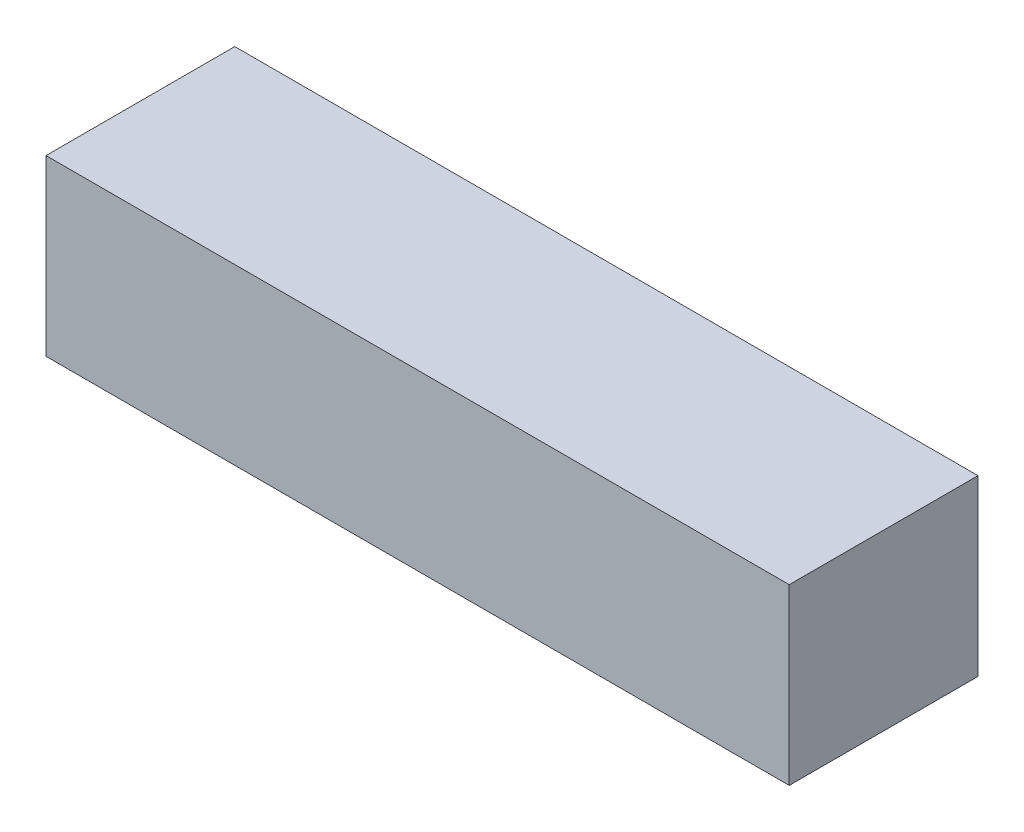
ISO-10303-21;
HEADER;
FILE_DESCRIPTION(('STEP AP214'),'2;1');
FILE_NAME('part.step','',(''),(''),'','','');
FILE_SCHEMA(('AUTOMOTIVE_DESIGN { 1 0 10303 214 1 1 1 1 }'));
ENDSEC;
DATA;
#1=APPLICATION_CONTEXT('core data for automotive mechanical design processes');
#2=APPLICATION_PROTOCOL_DEFINITION('international standard','automotive_design',2000,#1);
#3=PRODUCT_CONTEXT('',#1,'mechanical');
#4=PRODUCT('Part','Part','',(#3));
#5=PRODUCT_RELATED_PRODUCT_CATEGORY('part','',(#4));
#6=PRODUCT_DEFINITION_FORMATION('','',#4);
#7=PRODUCT_DEFINITION_CONTEXT('part definition',#1,'design');
#8=PRODUCT_DEFINITION('design','',#6,#7);
#9=PRODUCT_DEFINITION_SHAPE('','',#8);
#10=(LENGTH_UNIT() NAMED_UNIT(*) SI_UNIT(.MILLI.,.METRE.));
#11=(NAMED_UNIT(*) PLANE_ANGLE_UNIT() SI_UNIT($,.RADIAN.));
#12=(NAMED_UNIT(*) SI_UNIT($,.STERADIAN.) SOLID_ANGLE_UNIT());
#13=UNCERTAINTY_MEASURE_WITH_UNIT(LENGTH_MEASURE(1.E-05),#10,'distance_accuracy_value','');
#14=(GEOMETRIC_REPRESENTATION_CONTEXT(3) GLOBAL_UNCERTAINTY_ASSIGNED_CONTEXT((#13)) GLOBAL_UNIT_ASSIGNED_CONTEXT((#10,
#11,#12)) REPRESENTATION_CONTEXT('',''));
#15=CARTESIAN_POINT('',(0.,0.,0.));
#16=DIRECTION('',(0.,0.,1.));
#17=DIRECTION('',(1.,0.,0.));
#18=AXIS2_PLACEMENT_3D('',#15,#16,#17);
#19=CARTESIAN_POINT('',(40.,4.572,-34.14));
#20=DIRECTION('',(0.,1.,0.));
#21=DIRECTION('',(0.,0.,1.));
#22=AXIS2_PLACEMENT_3D('',#19,#20,#21);
#23=PLANE('',#22);
#24=DIRECTION('',(-1.,0.,0.));
#25=VECTOR('',#24,1.);
#26=CARTESIAN_POINT('',(40.001,4.572,-34.14));
#27=LINE('',#26,#25);
#28=CARTESIAN_POINT('',(40.,4.572,-34.14));
#29=VERTEX_POINT('',#28);
#30=CARTESIAN_POINT('',(0.,4.572,-34.14));
#31=VERTEX_POINT('',#30);
#32=EDGE_CURVE('E11',#29,#31,#27,.T.);
#33=ORIENTED_EDGE('',*,*,#32,.T.);
#34=DIRECTION('',(0.,0.,1.));
#35=VECTOR('',#34,1.);
#36=CARTESIAN_POINT('',(0.,4.572,0.));
#37=LINE('',#36,#35);
#38=CARTESIAN_POINT('',(0.,4.572,-44.3));
#39=VERTEX_POINT('',#38);
#40=EDGE_CURVE('E41',#39,#31,#37,.T.);
#41=ORIENTED_EDGE('',*,*,#40,.F.);
#42=DIRECTION('',(-1.,0.,0.));
#43=VECTOR('',#42,1.);
#44=CARTESIAN_POINT('',(0.,4.572,-44.3));
#45=LINE('',#44,#43);
#46=CARTESIAN_POINT('',(40.,4.572,-44.3));
#47=VERTEX_POINT('',#46);
#48=EDGE_CURVE('E95',#47,#39,#45,.T.);
#49=ORIENTED_EDGE('',*,*,#48,.F.);
#50=DIRECTION('',(0.,0.,-1.));
#51=VECTOR('',#50,1.);
#52=CARTESIAN_POINT('',(40.,4.572,0.));
#53=LINE('',#52,#51);
#54=EDGE_CURVE('E58',#29,#47,#53,.T.);
#55=ORIENTED_EDGE('',*,*,#54,.F.);
#56=EDGE_LOOP('',(#33,#41,#49,#55));
#57=FACE_BOUND('',#56,.T.);
#58=ADVANCED_FACE('F38',(#57),#23,.F.);
#59=CARTESIAN_POINT('',(40.,13.93,-10.16));
#60=DIRECTION('',(0.,-1.,0.));
#61=DIRECTION('',(0.,0.,-1.));
#62=AXIS2_PLACEMENT_3D('',#59,#60,#61);
#63=PLANE('',#62);
#64=DIRECTION('',(1.,0.,0.));
#65=VECTOR('',#64,1.);
#66=CARTESIAN_POINT('',(0.,13.93,-44.3));
#67=LINE('',#66,#65);
#68=CARTESIAN_POINT('',(0.,13.93,-44.3));
#69=VERTEX_POINT('',#68);
#70=CARTESIAN_POINT('',(40.,13.93,-44.3));
#71=VERTEX_POINT('',#70);
#72=EDGE_CURVE('E93',#69,#71,#67,.T.);
#73=ORIENTED_EDGE('',*,*,#72,.F.);
#74=DIRECTION('',(0.,0.,-1.));
#75=VECTOR('',#74,1.);
#76=CARTESIAN_POINT('',(0.,13.93,0.));
#77=LINE('',#76,#75);
#78=CARTESIAN_POINT('',(0.,13.93,-34.14));
#79=VERTEX_POINT('',#78);
#80=EDGE_CURVE('E90',#79,#69,#77,.T.);
#81=ORIENTED_EDGE('',*,*,#80,.F.);
#82=DIRECTION('',(-1.,0.,0.));
#83=VECTOR('',#82,1.);
#84=CARTESIAN_POINT('',(40.001,13.93,-34.14));
#85=LINE('',#84,#83);
#86=CARTESIAN_POINT('',(40.,13.93,-34.14));
#87=VERTEX_POINT('',#86);
#88=EDGE_CURVE('E80',#87,#79,#85,.T.);
#89=ORIENTED_EDGE('',*,*,#88,.F.);
#90=DIRECTION('',(0.,0.,1.));
#91=VECTOR('',#90,1.);
#92=CARTESIAN_POINT('',(40.,13.93,0.));
#93=LINE('',#92,#91);
#94=EDGE_CURVE('E96',#71,#87,#93,.T.);
#95=ORIENTED_EDGE('',*,*,#94,.F.);
#96=EDGE_LOOP('',(#73,#81,#89,#95));
#97=FACE_BOUND('',#96,.T.);
#98=ADVANCED_FACE('F91',(#97),#63,.F.);
#99=CARTESIAN_POINT('',(0.,15.2,0.));
#100=DIRECTION('',(1.,0.,0.));
#101=DIRECTION('',(0.,0.,-1.));
#102=AXIS2_PLACEMENT_3D('',#99,#100,#101);
#103=PLANE('',#102);
#104=DIRECTION('',(0.,-1.,0.));
#105=VECTOR('',#104,1.);
#106=CARTESIAN_POINT('',(0.,15.2,-44.3));
#107=LINE('',#106,#105);
#108=EDGE_CURVE('E87',#69,#39,#107,.T.);
#109=ORIENTED_EDGE('',*,*,#108,.T.);
#110=ORIENTED_EDGE('',*,*,#40,.T.);
#111=DIRECTION('',(0.,-1.,0.));
#112=VECTOR('',#111,1.);
#113=CARTESIAN_POINT('',(0.,13.93,-34.14));
#114=LINE('',#113,#112);
#115=EDGE_CURVE('E83',#79,#31,#114,.T.);
#116=ORIENTED_EDGE('',*,*,#115,.F.);
#117=ORIENTED_EDGE('',*,*,#80,.T.);
#118=EDGE_LOOP('',(#109,#110,#116,#117));
#119=FACE_BOUND('',#118,.T.);
#120=ADVANCED_FACE('F98',(#119),#103,.F.);
#121=CARTESIAN_POINT('',(40.,15.2,0.));
#122=DIRECTION('',(-1.,0.,0.));
#123=DIRECTION('',(0.,0.,1.));
#124=AXIS2_PLACEMENT_3D('',#121,#122,#123);
#125=PLANE('',#124);
#126=DIRECTION('',(0.,1.,0.));
#127=VECTOR('',#126,1.);
#128=CARTESIAN_POINT('',(40.,13.93,-34.14));
#129=LINE('',#128,#127);
#130=EDGE_CURVE('E85',#29,#87,#129,.T.);
#131=ORIENTED_EDGE('',*,*,#130,.F.);
#132=ORIENTED_EDGE('',*,*,#54,.T.);
#133=DIRECTION('',(0.,-1.,0.));
#134=VECTOR('',#133,1.);
#135=CARTESIAN_POINT('',(40.,15.2,-44.3));
#136=LINE('',#135,#134);
#137=EDGE_CURVE('E103',#71,#47,#136,.T.);
#138=ORIENTED_EDGE('',*,*,#137,.F.);
#139=ORIENTED_EDGE('',*,*,#94,.T.);
#140=EDGE_LOOP('',(#131,#132,#138,#139));
#141=FACE_BOUND('',#140,.T.);
#142=ADVANCED_FACE('F110',(#141),#125,.F.);
#143=CARTESIAN_POINT('',(0.,15.2,-44.3));
#144=DIRECTION('',(0.,0.,1.));
#145=DIRECTION('',(1.,0.,0.));
#146=AXIS2_PLACEMENT_3D('',#143,#144,#145);
#147=PLANE('',#146);
#148=ORIENTED_EDGE('',*,*,#137,.T.);
#149=ORIENTED_EDGE('',*,*,#48,.T.);
#150=ORIENTED_EDGE('',*,*,#108,.F.);
#151=ORIENTED_EDGE('',*,*,#72,.T.);
#152=EDGE_LOOP('',(#148,#149,#150,#151));
#153=FACE_BOUND('',#152,.T.);
#154=ADVANCED_FACE('F112',(#153),#147,.F.);
#155=CARTESIAN_POINT('',(40.001,13.93,-34.14));
#156=DIRECTION('',(0.,0.,-1.));
#157=DIRECTION('',(-1.,0.,0.));
#158=AXIS2_PLACEMENT_3D('',#155,#156,#157);
#159=PLANE('',#158);
#160=ORIENTED_EDGE('',*,*,#130,.T.);
#161=ORIENTED_EDGE('',*,*,#88,.T.);
#162=ORIENTED_EDGE('',*,*,#115,.T.);
#163=ORIENTED_EDGE('',*,*,#32,.F.);
#164=EDGE_LOOP('',(#160,#161,#162,#163));
#165=FACE_BOUND('',#164,.T.);
#166=ADVANCED_FACE('F82',(#165),#159,.F.);
#167=CLOSED_SHELL('',(#58,#98,#120,#142,#154,#166));
#168=MANIFOLD_SOLID_BREP('B2',#167);
#169=ADVANCED_BREP_SHAPE_REPRESENTATION('',(#18,#168),#14);
#170=SHAPE_DEFINITION_REPRESENTATION(#9,#169);
ENDSEC;
END-ISO-10303-21;
